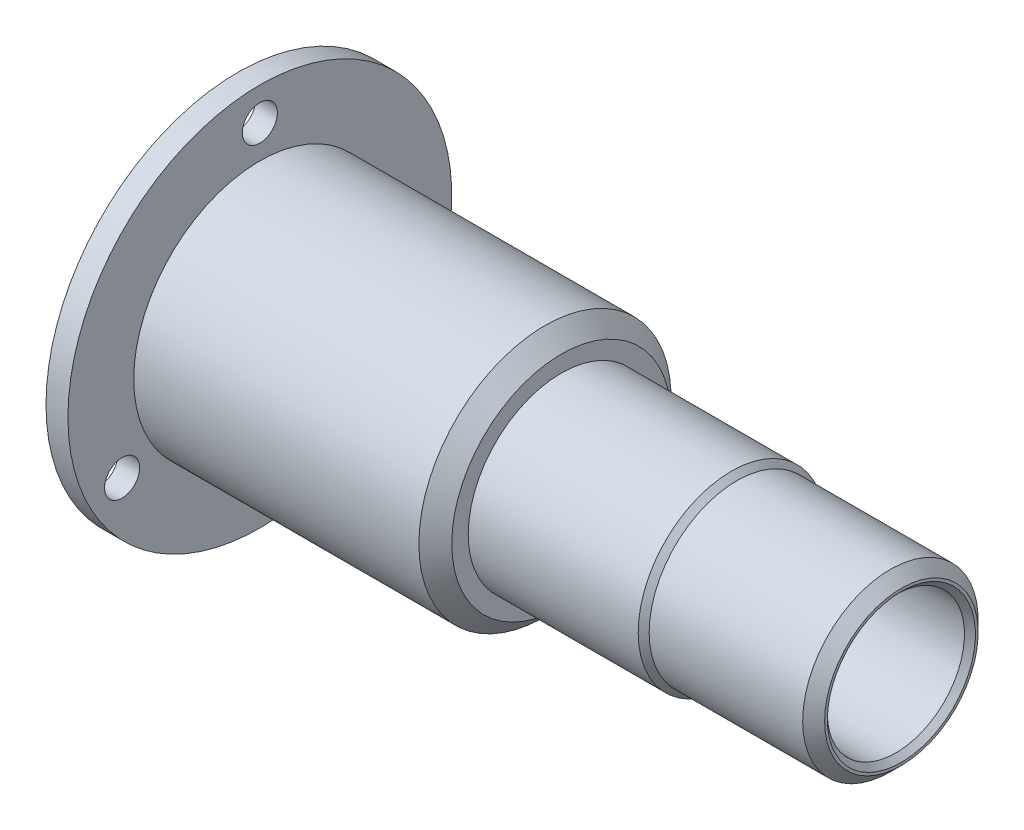
ISO-10303-21;
HEADER;
FILE_DESCRIPTION(('STEP AP214'),'2;1');
FILE_NAME('part.step','',(''),(''),'','','');
FILE_SCHEMA(('AUTOMOTIVE_DESIGN { 1 0 10303 214 1 1 1 1 }'));
ENDSEC;
DATA;
#1=APPLICATION_CONTEXT('core data for automotive mechanical design processes');
#2=APPLICATION_PROTOCOL_DEFINITION('international standard','automotive_design',2000,#1);
#3=PRODUCT_CONTEXT('',#1,'mechanical');
#4=PRODUCT('Part','Part','',(#3));
#5=PRODUCT_RELATED_PRODUCT_CATEGORY('part','',(#4));
#6=PRODUCT_DEFINITION_FORMATION('','',#4);
#7=PRODUCT_DEFINITION_CONTEXT('part definition',#1,'design');
#8=PRODUCT_DEFINITION('design','',#6,#7);
#9=PRODUCT_DEFINITION_SHAPE('','',#8);
#10=(LENGTH_UNIT() NAMED_UNIT(*) SI_UNIT(.MILLI.,.METRE.));
#11=(NAMED_UNIT(*) PLANE_ANGLE_UNIT() SI_UNIT($,.RADIAN.));
#12=(NAMED_UNIT(*) SI_UNIT($,.STERADIAN.) SOLID_ANGLE_UNIT());
#13=UNCERTAINTY_MEASURE_WITH_UNIT(LENGTH_MEASURE(1.E-05),#10,'distance_accuracy_value','');
#14=(GEOMETRIC_REPRESENTATION_CONTEXT(3) GLOBAL_UNCERTAINTY_ASSIGNED_CONTEXT((#13)) GLOBAL_UNIT_ASSIGNED_CONTEXT((#10,
#11,#12)) REPRESENTATION_CONTEXT('',''));
#15=CARTESIAN_POINT('',(0.,0.,0.));
#16=DIRECTION('',(0.,0.,1.));
#17=DIRECTION('',(1.,0.,0.));
#18=AXIS2_PLACEMENT_3D('',#15,#16,#17);
#19=CARTESIAN_POINT('',(0.,0.,0.));
#20=DIRECTION('',(-1.,0.,0.));
#21=DIRECTION('',(0.,0.,1.));
#22=AXIS2_PLACEMENT_3D('',#19,#20,#21);
#23=CYLINDRICAL_SURFACE('',#22,8.5);
#24=CARTESIAN_POINT('',(45.,0.,0.));
#25=DIRECTION('',(-1.,0.,0.));
#26=DIRECTION('',(0.,0.,1.));
#27=AXIS2_PLACEMENT_3D('',#24,#25,#26);
#28=CIRCLE('',#27,8.5);
#29=CARTESIAN_POINT('',(45.,0.,8.5));
#30=VERTEX_POINT('',#29);
#31=EDGE_CURVE('E46',#30,#30,#28,.T.);
#32=ORIENTED_EDGE('',*,*,#31,.T.);
#33=EDGE_LOOP('',(#32));
#34=FACE_BOUND('',#33,.T.);
#35=CARTESIAN_POINT('',(29.5,0.,0.));
#36=DIRECTION('',(-1.,0.,0.));
#37=DIRECTION('',(0.,0.,1.));
#38=AXIS2_PLACEMENT_3D('',#35,#36,#37);
#39=CIRCLE('',#38,8.5);
#40=CARTESIAN_POINT('',(29.5,0.,8.5));
#41=VERTEX_POINT('',#40);
#42=EDGE_CURVE('E70',#41,#41,#39,.T.);
#43=ORIENTED_EDGE('',*,*,#42,.F.);
#44=EDGE_LOOP('',(#43));
#45=FACE_BOUND('',#44,.T.);
#46=ADVANCED_FACE('F35',(#34,#45),#23,.T.);
#47=CARTESIAN_POINT('',(29.5,11.5,0.));
#48=DIRECTION('',(-1.,0.,0.));
#49=DIRECTION('',(0.,0.,1.));
#50=AXIS2_PLACEMENT_3D('',#47,#48,#49);
#51=PLANE('',#50);
#52=CARTESIAN_POINT('',(29.5,0.,0.));
#53=DIRECTION('',(-1.,0.,0.));
#54=DIRECTION('',(0.,0.,1.));
#55=AXIS2_PLACEMENT_3D('',#52,#53,#54);
#56=CIRCLE('',#55,10.);
#57=CARTESIAN_POINT('',(29.5,0.,10.));
#58=VERTEX_POINT('',#57);
#59=EDGE_CURVE('E64',#58,#58,#56,.F.);
#60=ORIENTED_EDGE('',*,*,#59,.T.);
#61=EDGE_LOOP('',(#60));
#62=FACE_BOUND('',#61,.T.);
#63=ORIENTED_EDGE('',*,*,#42,.T.);
#64=EDGE_LOOP('',(#63));
#65=FACE_BOUND('',#64,.T.);
#66=ADVANCED_FACE('F141',(#62,#65),#51,.F.);
#67=CARTESIAN_POINT('',(0.,0.,0.));
#68=DIRECTION('',(-1.,0.,0.));
#69=DIRECTION('',(0.,0.,1.));
#70=AXIS2_PLACEMENT_3D('',#67,#68,#69);
#71=CYLINDRICAL_SURFACE('',#70,11.5);
#72=CARTESIAN_POINT('',(28.,0.,0.));
#73=DIRECTION('',(-1.,0.,0.));
#74=DIRECTION('',(0.,0.,1.));
#75=AXIS2_PLACEMENT_3D('',#72,#73,#74);
#76=CIRCLE('',#75,11.5);
#77=CARTESIAN_POINT('',(28.,0.,11.5));
#78=VERTEX_POINT('',#77);
#79=EDGE_CURVE('E67',#78,#78,#76,.T.);
#80=ORIENTED_EDGE('',*,*,#79,.T.);
#81=EDGE_LOOP('',(#80));
#82=FACE_BOUND('',#81,.T.);
#83=CARTESIAN_POINT('',(2.,0.,0.));
#84=DIRECTION('',(-1.,0.,0.));
#85=DIRECTION('',(0.,0.,1.));
#86=AXIS2_PLACEMENT_3D('',#83,#84,#85);
#87=CIRCLE('',#86,11.5);
#88=CARTESIAN_POINT('',(2.,0.,11.5));
#89=VERTEX_POINT('',#88);
#90=EDGE_CURVE('E73',#89,#89,#87,.T.);
#91=ORIENTED_EDGE('',*,*,#90,.F.);
#92=EDGE_LOOP('',(#91));
#93=FACE_BOUND('',#92,.T.);
#94=ADVANCED_FACE('F135',(#82,#93),#71,.T.);
#95=CARTESIAN_POINT('',(2.,11.5,0.));
#96=DIRECTION('',(-1.,0.,0.));
#97=DIRECTION('',(0.,0.,1.));
#98=AXIS2_PLACEMENT_3D('',#95,#96,#97);
#99=PLANE('',#98);
#100=CARTESIAN_POINT('',(2.,-7.25000000000001,-12.5573683548744));
#101=DIRECTION('',(-1.,0.,0.));
#102=DIRECTION('',(0.,0.,1.));
#103=AXIS2_PLACEMENT_3D('',#100,#101,#102);
#104=CIRCLE('',#103,1.6);
#105=CARTESIAN_POINT('',(2.,-7.25000000000001,-10.9573683548744));
#106=VERTEX_POINT('',#105);
#107=EDGE_CURVE('E103',#106,#106,#104,.T.);
#108=ORIENTED_EDGE('',*,*,#107,.T.);
#109=EDGE_LOOP('',(#108));
#110=FACE_BOUND('',#109,.T.);
#111=CARTESIAN_POINT('',(2.,-7.25,12.5573683548744));
#112=DIRECTION('',(-1.,0.,0.));
#113=DIRECTION('',(0.,0.,1.));
#114=AXIS2_PLACEMENT_3D('',#111,#112,#113);
#115=CIRCLE('',#114,1.6);
#116=CARTESIAN_POINT('',(2.,-7.25,14.1573683548744));
#117=VERTEX_POINT('',#116);
#118=EDGE_CURVE('E97',#117,#117,#115,.T.);
#119=ORIENTED_EDGE('',*,*,#118,.T.);
#120=EDGE_LOOP('',(#119));
#121=FACE_BOUND('',#120,.T.);
#122=CARTESIAN_POINT('',(2.,14.5,0.));
#123=DIRECTION('',(-1.,0.,0.));
#124=DIRECTION('',(0.,0.,1.));
#125=AXIS2_PLACEMENT_3D('',#122,#123,#124);
#126=CIRCLE('',#125,1.6);
#127=CARTESIAN_POINT('',(2.,14.5,1.6));
#128=VERTEX_POINT('',#127);
#129=EDGE_CURVE('E91',#128,#128,#126,.T.);
#130=ORIENTED_EDGE('',*,*,#129,.T.);
#131=EDGE_LOOP('',(#130));
#132=FACE_BOUND('',#131,.T.);
#133=CARTESIAN_POINT('',(2.,0.,0.));
#134=DIRECTION('',(-1.,0.,0.));
#135=DIRECTION('',(0.,0.,1.));
#136=AXIS2_PLACEMENT_3D('',#133,#134,#135);
#137=CIRCLE('',#136,17.5);
#138=CARTESIAN_POINT('',(2.,0.,17.5));
#139=VERTEX_POINT('',#138);
#140=EDGE_CURVE('E76',#139,#139,#137,.T.);
#141=ORIENTED_EDGE('',*,*,#140,.F.);
#142=EDGE_LOOP('',(#141));
#143=FACE_BOUND('',#142,.T.);
#144=ORIENTED_EDGE('',*,*,#90,.T.);
#145=EDGE_LOOP('',(#144));
#146=FACE_BOUND('',#145,.T.);
#147=ADVANCED_FACE('F129',(#110,#121,#132,#143,#146),#99,.F.);
#148=CARTESIAN_POINT('',(0.,0.,0.));
#149=DIRECTION('',(-1.,0.,0.));
#150=DIRECTION('',(0.,0.,1.));
#151=AXIS2_PLACEMENT_3D('',#148,#149,#150);
#152=CYLINDRICAL_SURFACE('',#151,17.5);
#153=CARTESIAN_POINT('',(0.,0.,0.));
#154=DIRECTION('',(-1.,0.,0.));
#155=DIRECTION('',(0.,0.,1.));
#156=AXIS2_PLACEMENT_3D('',#153,#154,#155);
#157=CIRCLE('',#156,17.5);
#158=CARTESIAN_POINT('',(0.,0.,17.5));
#159=VERTEX_POINT('',#158);
#160=EDGE_CURVE('E79',#159,#159,#157,.T.);
#161=ORIENTED_EDGE('',*,*,#160,.F.);
#162=EDGE_LOOP('',(#161));
#163=FACE_BOUND('',#162,.T.);
#164=ORIENTED_EDGE('',*,*,#140,.T.);
#165=EDGE_LOOP('',(#164));
#166=FACE_BOUND('',#165,.T.);
#167=ADVANCED_FACE('F117',(#163,#166),#152,.T.);
#168=CARTESIAN_POINT('',(0.,9.,0.));
#169=DIRECTION('',(1.,0.,0.));
#170=DIRECTION('',(0.,0.,-1.));
#171=AXIS2_PLACEMENT_3D('',#168,#169,#170);
#172=PLANE('',#171);
#173=CARTESIAN_POINT('',(0.,-7.25000000000001,-12.5573683548744));
#174=DIRECTION('',(-1.,0.,0.));
#175=DIRECTION('',(0.,0.,1.));
#176=AXIS2_PLACEMENT_3D('',#173,#174,#175);
#177=CIRCLE('',#176,1.6);
#178=CARTESIAN_POINT('',(0.,-7.25000000000001,-10.9573683548744));
#179=VERTEX_POINT('',#178);
#180=EDGE_CURVE('E106',#179,#179,#177,.T.);
#181=ORIENTED_EDGE('',*,*,#180,.F.);
#182=EDGE_LOOP('',(#181));
#183=FACE_BOUND('',#182,.T.);
#184=CARTESIAN_POINT('',(0.,-7.25,12.5573683548744));
#185=DIRECTION('',(-1.,0.,0.));
#186=DIRECTION('',(0.,0.,1.));
#187=AXIS2_PLACEMENT_3D('',#184,#185,#186);
#188=CIRCLE('',#187,1.6);
#189=CARTESIAN_POINT('',(0.,-7.25,14.1573683548744));
#190=VERTEX_POINT('',#189);
#191=EDGE_CURVE('E100',#190,#190,#188,.T.);
#192=ORIENTED_EDGE('',*,*,#191,.F.);
#193=EDGE_LOOP('',(#192));
#194=FACE_BOUND('',#193,.T.);
#195=CARTESIAN_POINT('',(0.,14.5,0.));
#196=DIRECTION('',(-1.,0.,0.));
#197=DIRECTION('',(0.,0.,1.));
#198=AXIS2_PLACEMENT_3D('',#195,#196,#197);
#199=CIRCLE('',#198,1.6);
#200=CARTESIAN_POINT('',(0.,14.5,1.6));
#201=VERTEX_POINT('',#200);
#202=EDGE_CURVE('E94',#201,#201,#199,.T.);
#203=ORIENTED_EDGE('',*,*,#202,.F.);
#204=EDGE_LOOP('',(#203));
#205=FACE_BOUND('',#204,.T.);
#206=CARTESIAN_POINT('',(0.,0.,0.));
#207=DIRECTION('',(1.,0.,0.));
#208=DIRECTION('',(0.,0.,-1.));
#209=AXIS2_PLACEMENT_3D('',#206,#207,#208);
#210=CIRCLE('',#209,9.99999999999999);
#211=CARTESIAN_POINT('',(0.,0.,-9.99999999999999));
#212=VERTEX_POINT('',#211);
#213=EDGE_CURVE('E58',#212,#212,#210,.T.);
#214=ORIENTED_EDGE('',*,*,#213,.T.);
#215=EDGE_LOOP('',(#214));
#216=FACE_BOUND('',#215,.T.);
#217=ORIENTED_EDGE('',*,*,#160,.T.);
#218=EDGE_LOOP('',(#217));
#219=FACE_BOUND('',#218,.T.);
#220=ADVANCED_FACE('F113',(#183,#194,#205,#216,#219),#172,.F.);
#221=CARTESIAN_POINT('',(0.,0.,0.));
#222=DIRECTION('',(-1.,0.,0.));
#223=DIRECTION('',(0.,0.,1.));
#224=AXIS2_PLACEMENT_3D('',#221,#222,#223);
#225=CYLINDRICAL_SURFACE('',#224,9.);
#226=CARTESIAN_POINT('',(0.999999999999987,0.,0.));
#227=DIRECTION('',(1.,0.,0.));
#228=DIRECTION('',(0.,0.,-1.));
#229=AXIS2_PLACEMENT_3D('',#226,#227,#228);
#230=CIRCLE('',#229,9.);
#231=CARTESIAN_POINT('',(0.999999999999987,0.,-9.));
#232=VERTEX_POINT('',#231);
#233=EDGE_CURVE('E61',#232,#232,#230,.F.);
#234=ORIENTED_EDGE('',*,*,#233,.T.);
#235=EDGE_LOOP('',(#234));
#236=FACE_BOUND('',#235,.T.);
#237=CARTESIAN_POINT('',(26.5,0.,0.));
#238=DIRECTION('',(-1.,0.,0.));
#239=DIRECTION('',(0.,0.,1.));
#240=AXIS2_PLACEMENT_3D('',#237,#238,#239);
#241=CIRCLE('',#240,9.);
#242=CARTESIAN_POINT('',(26.5,0.,9.));
#243=VERTEX_POINT('',#242);
#244=EDGE_CURVE('E82',#243,#243,#241,.T.);
#245=ORIENTED_EDGE('',*,*,#244,.F.);
#246=EDGE_LOOP('',(#245));
#247=FACE_BOUND('',#246,.T.);
#248=ADVANCED_FACE('F116',(#236,#247),#225,.F.);
#249=CARTESIAN_POINT('',(26.5,6.25,0.));
#250=DIRECTION('',(1.,0.,0.));
#251=DIRECTION('',(0.,0.,-1.));
#252=AXIS2_PLACEMENT_3D('',#249,#250,#251);
#253=PLANE('',#252);
#254=CARTESIAN_POINT('',(26.5,0.,0.));
#255=DIRECTION('',(-1.,0.,0.));
#256=DIRECTION('',(0.,0.,1.));
#257=AXIS2_PLACEMENT_3D('',#254,#255,#256);
#258=CIRCLE('',#257,6.25);
#259=CARTESIAN_POINT('',(26.5,0.,6.25));
#260=VERTEX_POINT('',#259);
#261=EDGE_CURVE('E85',#260,#260,#258,.T.);
#262=ORIENTED_EDGE('',*,*,#261,.F.);
#263=EDGE_LOOP('',(#262));
#264=FACE_BOUND('',#263,.T.);
#265=ORIENTED_EDGE('',*,*,#244,.T.);
#266=EDGE_LOOP('',(#265));
#267=FACE_BOUND('',#266,.T.);
#268=ADVANCED_FACE('F194',(#264,#267),#253,.F.);
#269=CARTESIAN_POINT('',(0.,0.,0.));
#270=DIRECTION('',(-1.,0.,0.));
#271=DIRECTION('',(0.,0.,1.));
#272=AXIS2_PLACEMENT_3D('',#269,#270,#271);
#273=CYLINDRICAL_SURFACE('',#272,6.25);
#274=CARTESIAN_POINT('',(60.,0.,0.));
#275=DIRECTION('',(-1.,0.,0.));
#276=DIRECTION('',(0.,0.,1.));
#277=AXIS2_PLACEMENT_3D('',#274,#275,#276);
#278=CIRCLE('',#277,6.25);
#279=CARTESIAN_POINT('',(60.,0.,6.25));
#280=VERTEX_POINT('',#279);
#281=EDGE_CURVE('E10',#280,#280,#278,.F.);
#282=ORIENTED_EDGE('',*,*,#281,.T.);
#283=EDGE_LOOP('',(#282));
#284=FACE_BOUND('',#283,.T.);
#285=ORIENTED_EDGE('',*,*,#261,.T.);
#286=EDGE_LOOP('',(#285));
#287=FACE_BOUND('',#286,.T.);
#288=ADVANCED_FACE('F187',(#284,#287),#273,.F.);
#289=CARTESIAN_POINT('',(60.5,6.25,0.));
#290=DIRECTION('',(-1.,0.,0.));
#291=DIRECTION('',(0.,0.,1.));
#292=AXIS2_PLACEMENT_3D('',#289,#290,#291);
#293=PLANE('',#292);
#294=CARTESIAN_POINT('',(60.5,0.,0.));
#295=DIRECTION('',(-1.,0.,0.));
#296=DIRECTION('',(0.,0.,1.));
#297=AXIS2_PLACEMENT_3D('',#294,#295,#296);
#298=CIRCLE('',#297,6.74999999999999);
#299=CARTESIAN_POINT('',(60.5,0.,6.74999999999999));
#300=VERTEX_POINT('',#299);
#301=EDGE_CURVE('E42',#300,#300,#298,.T.);
#302=ORIENTED_EDGE('',*,*,#301,.T.);
#303=EDGE_LOOP('',(#302));
#304=FACE_BOUND('',#303,.T.);
#305=CARTESIAN_POINT('',(60.5,0.,0.));
#306=DIRECTION('',(-1.,0.,0.));
#307=DIRECTION('',(0.,0.,1.));
#308=AXIS2_PLACEMENT_3D('',#305,#306,#307);
#309=CIRCLE('',#308,6.99999999999999);
#310=CARTESIAN_POINT('',(60.5,0.,6.99999999999999));
#311=VERTEX_POINT('',#310);
#312=EDGE_CURVE('E50',#311,#311,#309,.F.);
#313=ORIENTED_EDGE('',*,*,#312,.T.);
#314=EDGE_LOOP('',(#313));
#315=FACE_BOUND('',#314,.T.);
#316=ADVANCED_FACE('F181',(#304,#315),#293,.F.);
#317=CARTESIAN_POINT('',(0.,0.,0.));
#318=DIRECTION('',(-1.,0.,0.));
#319=DIRECTION('',(0.,0.,1.));
#320=AXIS2_PLACEMENT_3D('',#317,#318,#319);
#321=CYLINDRICAL_SURFACE('',#320,8.);
#322=CARTESIAN_POINT('',(59.5,0.,0.));
#323=DIRECTION('',(-1.,0.,0.));
#324=DIRECTION('',(0.,0.,1.));
#325=AXIS2_PLACEMENT_3D('',#322,#323,#324);
#326=CIRCLE('',#325,8.);
#327=CARTESIAN_POINT('',(59.5,0.,8.));
#328=VERTEX_POINT('',#327);
#329=EDGE_CURVE('E55',#328,#328,#326,.T.);
#330=ORIENTED_EDGE('',*,*,#329,.T.);
#331=EDGE_LOOP('',(#330));
#332=FACE_BOUND('',#331,.T.);
#333=CARTESIAN_POINT('',(45.5,0.,0.));
#334=DIRECTION('',(-1.,0.,0.));
#335=DIRECTION('',(0.,0.,1.));
#336=AXIS2_PLACEMENT_3D('',#333,#334,#335);
#337=CIRCLE('',#336,8.);
#338=CARTESIAN_POINT('',(45.5,0.,8.));
#339=VERTEX_POINT('',#338);
#340=EDGE_CURVE('E88',#339,#339,#337,.T.);
#341=ORIENTED_EDGE('',*,*,#340,.F.);
#342=EDGE_LOOP('',(#341));
#343=FACE_BOUND('',#342,.T.);
#344=ADVANCED_FACE('F160',(#332,#343),#321,.T.);
#345=CARTESIAN_POINT('',(28.,0.,0.));
#346=DIRECTION('',(-1.,0.,0.));
#347=DIRECTION('',(0.,0.,1.));
#348=AXIS2_PLACEMENT_3D('',#345,#346,#347);
#349=CONICAL_SURFACE('',#348,11.5,0.785398163397452);
#350=ORIENTED_EDGE('',*,*,#59,.F.);
#351=EDGE_LOOP('',(#350));
#352=FACE_BOUND('',#351,.T.);
#353=ORIENTED_EDGE('',*,*,#79,.F.);
#354=EDGE_LOOP('',(#353));
#355=FACE_BOUND('',#354,.T.);
#356=ADVANCED_FACE('F156',(#352,#355),#349,.T.);
#357=CARTESIAN_POINT('',(0.999999999999987,0.,0.));
#358=DIRECTION('',(-1.,0.,0.));
#359=DIRECTION('',(0.,0.,1.));
#360=AXIS2_PLACEMENT_3D('',#357,#358,#359);
#361=CONICAL_SURFACE('',#360,9.,0.785398163397453);
#362=ORIENTED_EDGE('',*,*,#213,.F.);
#363=EDGE_LOOP('',(#362));
#364=FACE_BOUND('',#363,.T.);
#365=ORIENTED_EDGE('',*,*,#233,.F.);
#366=EDGE_LOOP('',(#365));
#367=FACE_BOUND('',#366,.T.);
#368=ADVANCED_FACE('F159',(#364,#367),#361,.F.);
#369=CARTESIAN_POINT('',(59.5,0.,0.));
#370=DIRECTION('',(-1.,0.,0.));
#371=DIRECTION('',(0.,0.,1.));
#372=AXIS2_PLACEMENT_3D('',#369,#370,#371);
#373=CONICAL_SURFACE('',#372,8.,0.785398163397455);
#374=ORIENTED_EDGE('',*,*,#312,.F.);
#375=EDGE_LOOP('',(#374));
#376=FACE_BOUND('',#375,.T.);
#377=ORIENTED_EDGE('',*,*,#329,.F.);
#378=EDGE_LOOP('',(#377));
#379=FACE_BOUND('',#378,.T.);
#380=ADVANCED_FACE('F164',(#376,#379),#373,.T.);
#381=CARTESIAN_POINT('',(45.,0.,0.));
#382=DIRECTION('',(-1.,0.,0.));
#383=DIRECTION('',(0.,0.,1.));
#384=AXIS2_PLACEMENT_3D('',#381,#382,#383);
#385=CONICAL_SURFACE('',#384,8.5,0.785398163397445);
#386=ORIENTED_EDGE('',*,*,#340,.T.);
#387=EDGE_LOOP('',(#386));
#388=FACE_BOUND('',#387,.T.);
#389=ORIENTED_EDGE('',*,*,#31,.F.);
#390=EDGE_LOOP('',(#389));
#391=FACE_BOUND('',#390,.T.);
#392=ADVANCED_FACE('F167',(#388,#391),#385,.T.);
#393=CARTESIAN_POINT('',(60.5,0.,0.));
#394=DIRECTION('',(1.,0.,0.));
#395=DIRECTION('',(0.,0.,-1.));
#396=AXIS2_PLACEMENT_3D('',#393,#394,#395);
#397=CONICAL_SURFACE('',#396,6.74999999999999,0.785398163397442);
#398=ORIENTED_EDGE('',*,*,#281,.F.);
#399=EDGE_LOOP('',(#398));
#400=FACE_BOUND('',#399,.T.);
#401=ORIENTED_EDGE('',*,*,#301,.F.);
#402=EDGE_LOOP('',(#401));
#403=FACE_BOUND('',#402,.T.);
#404=ADVANCED_FACE('F37',(#400,#403),#397,.F.);
#405=CARTESIAN_POINT('',(10.,14.5,0.));
#406=DIRECTION('',(-1.,0.,0.));
#407=DIRECTION('',(0.,0.,1.));
#408=AXIS2_PLACEMENT_3D('',#405,#406,#407);
#409=CYLINDRICAL_SURFACE('',#408,1.6);
#410=ORIENTED_EDGE('',*,*,#202,.T.);
#411=EDGE_LOOP('',(#410));
#412=FACE_BOUND('',#411,.T.);
#413=ORIENTED_EDGE('',*,*,#129,.F.);
#414=EDGE_LOOP('',(#413));
#415=FACE_BOUND('',#414,.T.);
#416=ADVANCED_FACE('F174',(#412,#415),#409,.F.);
#417=CARTESIAN_POINT('',(10.,-7.25,12.5573683548744));
#418=DIRECTION('',(-1.,0.,0.));
#419=DIRECTION('',(0.,0.,1.));
#420=AXIS2_PLACEMENT_3D('',#417,#418,#419);
#421=CYLINDRICAL_SURFACE('',#420,1.6);
#422=ORIENTED_EDGE('',*,*,#191,.T.);
#423=EDGE_LOOP('',(#422));
#424=FACE_BOUND('',#423,.T.);
#425=ORIENTED_EDGE('',*,*,#118,.F.);
#426=EDGE_LOOP('',(#425));
#427=FACE_BOUND('',#426,.T.);
#428=ADVANCED_FACE('F258',(#424,#427),#421,.F.);
#429=CARTESIAN_POINT('',(10.,-7.25000000000001,-12.5573683548744));
#430=DIRECTION('',(-1.,0.,0.));
#431=DIRECTION('',(0.,0.,1.));
#432=AXIS2_PLACEMENT_3D('',#429,#430,#431);
#433=CYLINDRICAL_SURFACE('',#432,1.6);
#434=ORIENTED_EDGE('',*,*,#180,.T.);
#435=EDGE_LOOP('',(#434));
#436=FACE_BOUND('',#435,.T.);
#437=ORIENTED_EDGE('',*,*,#107,.F.);
#438=EDGE_LOOP('',(#437));
#439=FACE_BOUND('',#438,.T.);
#440=ADVANCED_FACE('F110',(#436,#439),#433,.F.);
#441=CLOSED_SHELL('',(#46,#66,#94,#147,#167,#220,#248,#268,#288,#316,#344,#356,#368,#380,#392,
#404,#416,#428,#440));
#442=MANIFOLD_SOLID_BREP('B2',#441);
#443=ADVANCED_BREP_SHAPE_REPRESENTATION('',(#18,#442),#14);
#444=SHAPE_DEFINITION_REPRESENTATION(#9,#443);
ENDSEC;
END-ISO-10303-21;
